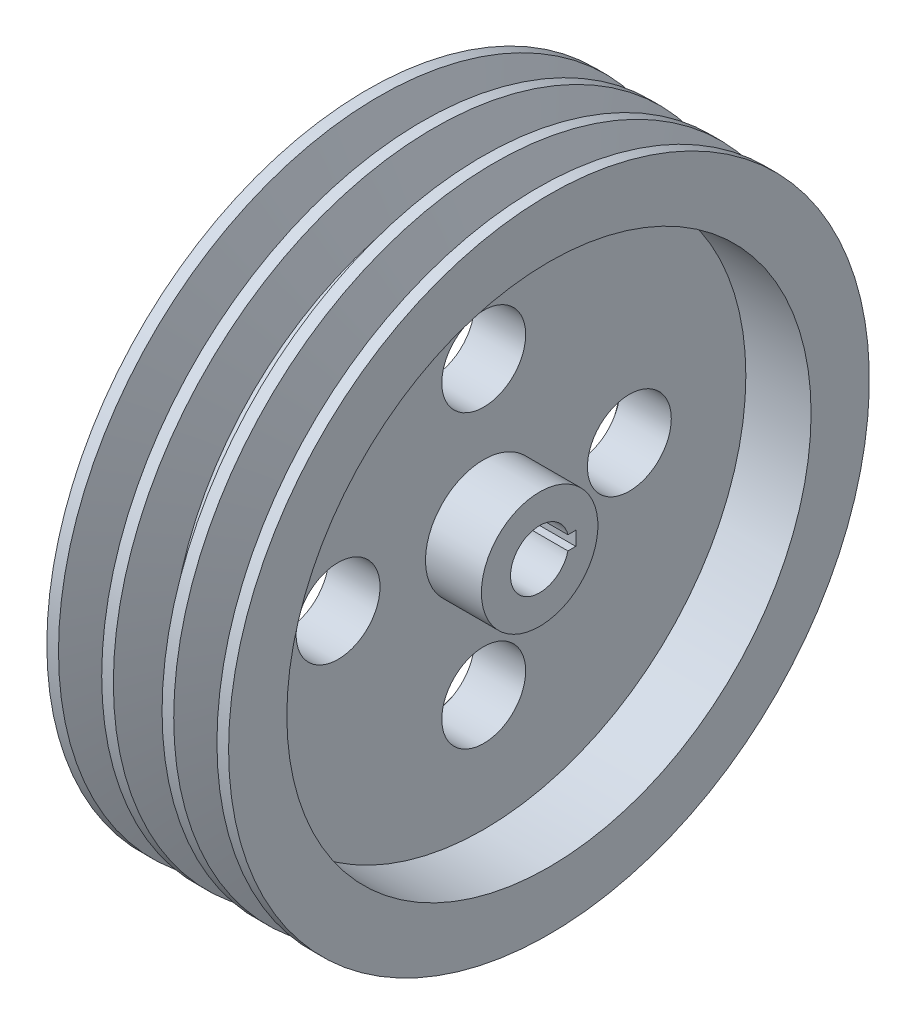
ISO-10303-21;
HEADER;
FILE_DESCRIPTION(('STEP AP214'),'2;1');
FILE_NAME('part.step','',(''),(''),'','','');
FILE_SCHEMA(('AUTOMOTIVE_DESIGN { 1 0 10303 214 1 1 1 1 }'));
ENDSEC;
DATA;
#1=APPLICATION_CONTEXT('core data for automotive mechanical design processes');
#2=APPLICATION_PROTOCOL_DEFINITION('international standard','automotive_design',2000,#1);
#3=PRODUCT_CONTEXT('',#1,'mechanical');
#4=PRODUCT('Part','Part','',(#3));
#5=PRODUCT_RELATED_PRODUCT_CATEGORY('part','',(#4));
#6=PRODUCT_DEFINITION_FORMATION('','',#4);
#7=PRODUCT_DEFINITION_CONTEXT('part definition',#1,'design');
#8=PRODUCT_DEFINITION('design','',#6,#7);
#9=PRODUCT_DEFINITION_SHAPE('','',#8);
#10=(LENGTH_UNIT() NAMED_UNIT(*) SI_UNIT(.MILLI.,.METRE.));
#11=(NAMED_UNIT(*) PLANE_ANGLE_UNIT() SI_UNIT($,.RADIAN.));
#12=(NAMED_UNIT(*) SI_UNIT($,.STERADIAN.) SOLID_ANGLE_UNIT());
#13=UNCERTAINTY_MEASURE_WITH_UNIT(LENGTH_MEASURE(1.E-05),#10,'distance_accuracy_value','');
#14=(GEOMETRIC_REPRESENTATION_CONTEXT(3) GLOBAL_UNCERTAINTY_ASSIGNED_CONTEXT((#13)) GLOBAL_UNIT_ASSIGNED_CONTEXT((#10,
#11,#12)) REPRESENTATION_CONTEXT('',''));
#15=CARTESIAN_POINT('',(0.,0.,0.));
#16=DIRECTION('',(0.,0.,1.));
#17=DIRECTION('',(1.,0.,0.));
#18=AXIS2_PLACEMENT_3D('',#15,#16,#17);
#19=CARTESIAN_POINT('',(-35.,0.,0.));
#20=DIRECTION('',(-1.,0.,0.));
#21=DIRECTION('',(0.,0.,1.));
#22=AXIS2_PLACEMENT_3D('',#19,#20,#21);
#23=CYLINDRICAL_SURFACE('',#22,137.5);
#24=CARTESIAN_POINT('',(15.4523068974331,0.,0.));
#25=DIRECTION('',(-1.,0.,0.));
#26=DIRECTION('',(0.,0.,1.));
#27=AXIS2_PLACEMENT_3D('',#24,#25,#26);
#28=CIRCLE('',#27,137.5);
#29=CARTESIAN_POINT('',(15.4523068974331,0.,137.5));
#30=VERTEX_POINT('',#29);
#31=EDGE_CURVE('E110',#30,#30,#28,.T.);
#32=ORIENTED_EDGE('',*,*,#31,.T.);
#33=EDGE_LOOP('',(#32));
#34=FACE_BOUND('',#33,.T.);
#35=CARTESIAN_POINT('',(10.4523068974331,0.,0.));
#36=DIRECTION('',(-1.,0.,0.));
#37=DIRECTION('',(0.,0.,1.));
#38=AXIS2_PLACEMENT_3D('',#35,#36,#37);
#39=CIRCLE('',#38,137.5);
#40=CARTESIAN_POINT('',(10.4523068974331,0.,137.5));
#41=VERTEX_POINT('',#40);
#42=EDGE_CURVE('E46',#41,#41,#39,.T.);
#43=ORIENTED_EDGE('',*,*,#42,.F.);
#44=EDGE_LOOP('',(#43));
#45=FACE_BOUND('',#44,.T.);
#46=ADVANCED_FACE('F39',(#34,#45),#23,.T.);
#47=CARTESIAN_POINT('',(3.90084268064155,0.,0.));
#48=DIRECTION('',(1.,0.,0.));
#49=DIRECTION('',(0.,0.,-1.));
#50=AXIS2_PLACEMENT_3D('',#47,#48,#49);
#51=CONICAL_SURFACE('',#50,119.5,1.22173047639604);
#52=ORIENTED_EDGE('',*,*,#42,.T.);
#53=EDGE_LOOP('',(#52));
#54=FACE_BOUND('',#53,.T.);
#55=CARTESIAN_POINT('',(3.90084268064155,0.,0.));
#56=DIRECTION('',(-1.,0.,0.));
#57=DIRECTION('',(0.,0.,1.));
#58=AXIS2_PLACEMENT_3D('',#55,#56,#57);
#59=CIRCLE('',#58,119.5);
#60=CARTESIAN_POINT('',(3.90084268064155,0.,119.5));
#61=VERTEX_POINT('',#60);
#62=EDGE_CURVE('E175',#61,#61,#59,.T.);
#63=ORIENTED_EDGE('',*,*,#62,.F.);
#64=EDGE_LOOP('',(#63));
#65=FACE_BOUND('',#64,.T.);
#66=ADVANCED_FACE('F180',(#54,#65),#51,.T.);
#67=CARTESIAN_POINT('',(-35.,0.,0.));
#68=DIRECTION('',(-1.,0.,0.));
#69=DIRECTION('',(0.,0.,1.));
#70=AXIS2_PLACEMENT_3D('',#67,#68,#69);
#71=CYLINDRICAL_SURFACE('',#70,119.5);
#72=ORIENTED_EDGE('',*,*,#62,.T.);
#73=EDGE_LOOP('',(#72));
#74=FACE_BOUND('',#73,.T.);
#75=CARTESIAN_POINT('',(-3.90084268064157,0.,0.));
#76=DIRECTION('',(-1.,0.,0.));
#77=DIRECTION('',(0.,0.,1.));
#78=AXIS2_PLACEMENT_3D('',#75,#76,#77);
#79=CIRCLE('',#78,119.5);
#80=CARTESIAN_POINT('',(-3.90084268064157,0.,119.5));
#81=VERTEX_POINT('',#80);
#82=EDGE_CURVE('E172',#81,#81,#79,.T.);
#83=ORIENTED_EDGE('',*,*,#82,.F.);
#84=EDGE_LOOP('',(#83));
#85=FACE_BOUND('',#84,.T.);
#86=ADVANCED_FACE('F188',(#74,#85),#71,.T.);
#87=CARTESIAN_POINT('',(-10.4523068974332,0.,0.));
#88=DIRECTION('',(-1.,0.,0.));
#89=DIRECTION('',(0.,0.,1.));
#90=AXIS2_PLACEMENT_3D('',#87,#88,#89);
#91=CONICAL_SURFACE('',#90,137.5,1.22173047639603);
#92=ORIENTED_EDGE('',*,*,#82,.T.);
#93=EDGE_LOOP('',(#92));
#94=FACE_BOUND('',#93,.T.);
#95=CARTESIAN_POINT('',(-10.4523068974332,0.,0.));
#96=DIRECTION('',(-1.,0.,0.));
#97=DIRECTION('',(0.,0.,1.));
#98=AXIS2_PLACEMENT_3D('',#95,#96,#97);
#99=CIRCLE('',#98,137.5);
#100=CARTESIAN_POINT('',(-10.4523068974332,0.,137.5));
#101=VERTEX_POINT('',#100);
#102=EDGE_CURVE('E169',#101,#101,#99,.T.);
#103=ORIENTED_EDGE('',*,*,#102,.F.);
#104=EDGE_LOOP('',(#103));
#105=FACE_BOUND('',#104,.T.);
#106=ADVANCED_FACE('F280',(#94,#105),#91,.T.);
#107=CARTESIAN_POINT('',(-35.,0.,0.));
#108=DIRECTION('',(-1.,0.,0.));
#109=DIRECTION('',(0.,0.,1.));
#110=AXIS2_PLACEMENT_3D('',#107,#108,#109);
#111=CYLINDRICAL_SURFACE('',#110,137.5);
#112=ORIENTED_EDGE('',*,*,#102,.T.);
#113=EDGE_LOOP('',(#112));
#114=FACE_BOUND('',#113,.T.);
#115=CARTESIAN_POINT('',(-15.4523068974332,0.,0.));
#116=DIRECTION('',(-1.,0.,0.));
#117=DIRECTION('',(0.,0.,1.));
#118=AXIS2_PLACEMENT_3D('',#115,#116,#117);
#119=CIRCLE('',#118,137.5);
#120=CARTESIAN_POINT('',(-15.4523068974332,0.,137.5));
#121=VERTEX_POINT('',#120);
#122=EDGE_CURVE('E166',#121,#121,#119,.T.);
#123=ORIENTED_EDGE('',*,*,#122,.F.);
#124=EDGE_LOOP('',(#123));
#125=FACE_BOUND('',#124,.T.);
#126=ADVANCED_FACE('F276',(#114,#125),#111,.T.);
#127=CARTESIAN_POINT('',(-22.0037711142248,0.,0.));
#128=DIRECTION('',(1.,0.,0.));
#129=DIRECTION('',(0.,0.,-1.));
#130=AXIS2_PLACEMENT_3D('',#127,#128,#129);
#131=CONICAL_SURFACE('',#130,119.5,1.22173047639603);
#132=ORIENTED_EDGE('',*,*,#122,.T.);
#133=EDGE_LOOP('',(#132));
#134=FACE_BOUND('',#133,.T.);
#135=CARTESIAN_POINT('',(-22.0037711142248,0.,0.));
#136=DIRECTION('',(-1.,0.,0.));
#137=DIRECTION('',(0.,0.,1.));
#138=AXIS2_PLACEMENT_3D('',#135,#136,#137);
#139=CIRCLE('',#138,119.5);
#140=CARTESIAN_POINT('',(-22.0037711142248,0.,119.5));
#141=VERTEX_POINT('',#140);
#142=EDGE_CURVE('E163',#141,#141,#139,.T.);
#143=ORIENTED_EDGE('',*,*,#142,.F.);
#144=EDGE_LOOP('',(#143));
#145=FACE_BOUND('',#144,.T.);
#146=ADVANCED_FACE('F272',(#134,#145),#131,.T.);
#147=CARTESIAN_POINT('',(-35.,0.,0.));
#148=DIRECTION('',(-1.,0.,0.));
#149=DIRECTION('',(0.,0.,1.));
#150=AXIS2_PLACEMENT_3D('',#147,#148,#149);
#151=CYLINDRICAL_SURFACE('',#150,119.5);
#152=ORIENTED_EDGE('',*,*,#142,.T.);
#153=EDGE_LOOP('',(#152));
#154=FACE_BOUND('',#153,.T.);
#155=CARTESIAN_POINT('',(-27.4485357832085,0.,0.));
#156=DIRECTION('',(-1.,0.,0.));
#157=DIRECTION('',(0.,0.,1.));
#158=AXIS2_PLACEMENT_3D('',#155,#156,#157);
#159=CIRCLE('',#158,119.5);
#160=CARTESIAN_POINT('',(-27.4485357832085,0.,119.5));
#161=VERTEX_POINT('',#160);
#162=EDGE_CURVE('E160',#161,#161,#159,.T.);
#163=ORIENTED_EDGE('',*,*,#162,.F.);
#164=EDGE_LOOP('',(#163));
#165=FACE_BOUND('',#164,.T.);
#166=ADVANCED_FACE('F268',(#154,#165),#151,.T.);
#167=CARTESIAN_POINT('',(-34.0000000000001,0.,0.));
#168=DIRECTION('',(-1.,0.,0.));
#169=DIRECTION('',(0.,0.,1.));
#170=AXIS2_PLACEMENT_3D('',#167,#168,#169);
#171=CONICAL_SURFACE('',#170,137.5,1.22173047639603);
#172=ORIENTED_EDGE('',*,*,#162,.T.);
#173=EDGE_LOOP('',(#172));
#174=FACE_BOUND('',#173,.T.);
#175=CARTESIAN_POINT('',(-34.0000000000001,0.,0.));
#176=DIRECTION('',(-1.,0.,0.));
#177=DIRECTION('',(0.,0.,1.));
#178=AXIS2_PLACEMENT_3D('',#175,#176,#177);
#179=CIRCLE('',#178,137.5);
#180=CARTESIAN_POINT('',(-34.0000000000001,0.,137.5));
#181=VERTEX_POINT('',#180);
#182=EDGE_CURVE('E157',#181,#181,#179,.T.);
#183=ORIENTED_EDGE('',*,*,#182,.F.);
#184=EDGE_LOOP('',(#183));
#185=FACE_BOUND('',#184,.T.);
#186=ADVANCED_FACE('F264',(#174,#185),#171,.T.);
#187=CARTESIAN_POINT('',(-35.,0.,0.));
#188=DIRECTION('',(-1.,0.,0.));
#189=DIRECTION('',(0.,0.,1.));
#190=AXIS2_PLACEMENT_3D('',#187,#188,#189);
#191=CYLINDRICAL_SURFACE('',#190,137.5);
#192=ORIENTED_EDGE('',*,*,#182,.T.);
#193=EDGE_LOOP('',(#192));
#194=FACE_BOUND('',#193,.T.);
#195=CARTESIAN_POINT('',(-39.0000000000001,0.,0.));
#196=DIRECTION('',(-1.,0.,0.));
#197=DIRECTION('',(0.,0.,1.));
#198=AXIS2_PLACEMENT_3D('',#195,#196,#197);
#199=CIRCLE('',#198,137.5);
#200=CARTESIAN_POINT('',(-39.0000000000001,0.,137.5));
#201=VERTEX_POINT('',#200);
#202=EDGE_CURVE('E154',#201,#201,#199,.T.);
#203=ORIENTED_EDGE('',*,*,#202,.F.);
#204=EDGE_LOOP('',(#203));
#205=FACE_BOUND('',#204,.T.);
#206=ADVANCED_FACE('F260',(#194,#205),#191,.T.);
#207=CARTESIAN_POINT('',(-39.0000000000001,0.,0.));
#208=DIRECTION('',(-1.,0.,0.));
#209=DIRECTION('',(0.,0.,1.));
#210=AXIS2_PLACEMENT_3D('',#207,#208,#209);
#211=PLANE('',#210);
#212=ORIENTED_EDGE('',*,*,#202,.T.);
#213=EDGE_LOOP('',(#212));
#214=FACE_BOUND('',#213,.T.);
#215=CARTESIAN_POINT('',(-39.0000000000001,0.,0.));
#216=DIRECTION('',(-1.,0.,0.));
#217=DIRECTION('',(0.,0.,1.));
#218=AXIS2_PLACEMENT_3D('',#215,#216,#217);
#219=CIRCLE('',#218,112.5);
#220=CARTESIAN_POINT('',(-39.0000000000001,0.,112.5));
#221=VERTEX_POINT('',#220);
#222=EDGE_CURVE('E151',#221,#221,#219,.T.);
#223=ORIENTED_EDGE('',*,*,#222,.F.);
#224=EDGE_LOOP('',(#223));
#225=FACE_BOUND('',#224,.T.);
#226=ADVANCED_FACE('F256',(#214,#225),#211,.T.);
#227=CARTESIAN_POINT('',(-35.,0.,0.));
#228=DIRECTION('',(-1.,0.,0.));
#229=DIRECTION('',(0.,0.,1.));
#230=AXIS2_PLACEMENT_3D('',#227,#228,#229);
#231=CYLINDRICAL_SURFACE('',#230,112.5);
#232=ORIENTED_EDGE('',*,*,#222,.T.);
#233=EDGE_LOOP('',(#232));
#234=FACE_BOUND('',#233,.T.);
#235=CARTESIAN_POINT('',(-11.,0.,0.));
#236=DIRECTION('',(-1.,0.,0.));
#237=DIRECTION('',(0.,0.,1.));
#238=AXIS2_PLACEMENT_3D('',#235,#236,#237);
#239=CIRCLE('',#238,112.5);
#240=CARTESIAN_POINT('',(-11.,0.,112.5));
#241=VERTEX_POINT('',#240);
#242=EDGE_CURVE('E148',#241,#241,#239,.T.);
#243=ORIENTED_EDGE('',*,*,#242,.F.);
#244=EDGE_LOOP('',(#243));
#245=FACE_BOUND('',#244,.T.);
#246=ADVANCED_FACE('F252',(#234,#245),#231,.F.);
#247=CARTESIAN_POINT('',(-11.,0.,0.));
#248=DIRECTION('',(-1.,0.,0.));
#249=DIRECTION('',(0.,0.,1.));
#250=AXIS2_PLACEMENT_3D('',#247,#248,#249);
#251=PLANE('',#250);
#252=CARTESIAN_POINT('',(-11.,62.5,0.));
#253=DIRECTION('',(-1.,0.,0.));
#254=DIRECTION('',(0.,0.,1.));
#255=AXIS2_PLACEMENT_3D('',#252,#253,#254);
#256=CIRCLE('',#255,18.);
#257=CARTESIAN_POINT('',(-11.,62.5,18.));
#258=VERTEX_POINT('',#257);
#259=EDGE_CURVE('E98',#258,#258,#256,.T.);
#260=ORIENTED_EDGE('',*,*,#259,.F.);
#261=EDGE_LOOP('',(#260));
#262=FACE_BOUND('',#261,.T.);
#263=CARTESIAN_POINT('',(-11.,1.76487577565824E-12,-62.5000000000018));
#264=DIRECTION('',(-1.,0.,0.));
#265=DIRECTION('',(0.,0.,1.));
#266=AXIS2_PLACEMENT_3D('',#263,#264,#265);
#267=CIRCLE('',#266,18.0000000000014);
#268=CARTESIAN_POINT('',(-11.,1.76487577565824E-12,-44.5000000000004));
#269=VERTEX_POINT('',#268);
#270=EDGE_CURVE('E610',#269,#269,#267,.T.);
#271=ORIENTED_EDGE('',*,*,#270,.F.);
#272=EDGE_LOOP('',(#271));
#273=FACE_BOUND('',#272,.T.);
#274=CARTESIAN_POINT('',(-11.,-62.5,-3.53261214567954E-12));
#275=DIRECTION('',(-1.,0.,0.));
#276=DIRECTION('',(0.,0.,1.));
#277=AXIS2_PLACEMENT_3D('',#274,#275,#276);
#278=CIRCLE('',#277,18.0000000000038);
#279=CARTESIAN_POINT('',(-11.,-62.5,18.0000000000003));
#280=VERTEX_POINT('',#279);
#281=EDGE_CURVE('E597',#280,#280,#278,.T.);
#282=ORIENTED_EDGE('',*,*,#281,.F.);
#283=EDGE_LOOP('',(#282));
#284=FACE_BOUND('',#283,.T.);
#285=CARTESIAN_POINT('',(-11.,-1.77252981815291E-12,62.4999999999982));
#286=DIRECTION('',(-1.,0.,0.));
#287=DIRECTION('',(0.,0.,1.));
#288=AXIS2_PLACEMENT_3D('',#285,#286,#287);
#289=CIRCLE('',#288,18.0000000000028);
#290=CARTESIAN_POINT('',(-11.,-1.77252981815291E-12,80.5000000000011));
#291=VERTEX_POINT('',#290);
#292=EDGE_CURVE('E593',#291,#291,#289,.T.);
#293=ORIENTED_EDGE('',*,*,#292,.F.);
#294=EDGE_LOOP('',(#293));
#295=FACE_BOUND('',#294,.T.);
#296=ORIENTED_EDGE('',*,*,#242,.T.);
#297=EDGE_LOOP('',(#296));
#298=FACE_BOUND('',#297,.T.);
#299=CARTESIAN_POINT('',(-11.,0.,0.));
#300=DIRECTION('',(-1.,0.,0.));
#301=DIRECTION('',(0.,0.,1.));
#302=AXIS2_PLACEMENT_3D('',#299,#300,#301);
#303=CIRCLE('',#302,25.);
#304=CARTESIAN_POINT('',(-11.,0.,25.));
#305=VERTEX_POINT('',#304);
#306=EDGE_CURVE('E145',#305,#305,#303,.T.);
#307=ORIENTED_EDGE('',*,*,#306,.F.);
#308=EDGE_LOOP('',(#307));
#309=FACE_BOUND('',#308,.T.);
#310=ADVANCED_FACE('F248',(#262,#273,#284,#295,#298,#309),#251,.T.);
#311=CARTESIAN_POINT('',(-35.,0.,0.));
#312=DIRECTION('',(-1.,0.,0.));
#313=DIRECTION('',(0.,0.,1.));
#314=AXIS2_PLACEMENT_3D('',#311,#312,#313);
#315=CYLINDRICAL_SURFACE('',#314,25.);
#316=ORIENTED_EDGE('',*,*,#306,.T.);
#317=EDGE_LOOP('',(#316));
#318=FACE_BOUND('',#317,.T.);
#319=CARTESIAN_POINT('',(-35.,0.,0.));
#320=DIRECTION('',(-1.,0.,0.));
#321=DIRECTION('',(0.,0.,1.));
#322=AXIS2_PLACEMENT_3D('',#319,#320,#321);
#323=CIRCLE('',#322,25.);
#324=CARTESIAN_POINT('',(-35.,0.,25.));
#325=VERTEX_POINT('',#324);
#326=EDGE_CURVE('E142',#325,#325,#323,.T.);
#327=ORIENTED_EDGE('',*,*,#326,.F.);
#328=EDGE_LOOP('',(#327));
#329=FACE_BOUND('',#328,.T.);
#330=ADVANCED_FACE('F244',(#318,#329),#315,.T.);
#331=CARTESIAN_POINT('',(-35.,0.,0.));
#332=DIRECTION('',(-1.,0.,0.));
#333=DIRECTION('',(0.,0.,1.));
#334=AXIS2_PLACEMENT_3D('',#331,#332,#333);
#335=PLANE('',#334);
#336=DIRECTION('',(0.,0.,-1.));
#337=VECTOR('',#336,1.);
#338=CARTESIAN_POINT('',(-35.,3.,0.));
#339=LINE('',#338,#337);
#340=CARTESIAN_POINT('',(-35.,3.,-12.1346610995116));
#341=VERTEX_POINT('',#340);
#342=CARTESIAN_POINT('',(-35.,3.,-15.5));
#343=VERTEX_POINT('',#342);
#344=EDGE_CURVE('E108',#341,#343,#339,.T.);
#345=ORIENTED_EDGE('',*,*,#344,.F.);
#346=CARTESIAN_POINT('',(-35.,0.,0.));
#347=DIRECTION('',(-1.,0.,0.));
#348=DIRECTION('',(0.,0.,1.));
#349=AXIS2_PLACEMENT_3D('',#346,#347,#348);
#350=CIRCLE('',#349,12.5);
#351=CARTESIAN_POINT('',(-35.,-3.,-12.1346610995116));
#352=VERTEX_POINT('',#351);
#353=EDGE_CURVE('E139',#352,#341,#350,.T.);
#354=ORIENTED_EDGE('',*,*,#353,.F.);
#355=DIRECTION('',(0.,0.,1.));
#356=VECTOR('',#355,1.);
#357=CARTESIAN_POINT('',(-35.,-3.,0.));
#358=LINE('',#357,#356);
#359=CARTESIAN_POINT('',(-35.,-3.,-15.5));
#360=VERTEX_POINT('',#359);
#361=EDGE_CURVE('E104',#360,#352,#358,.T.);
#362=ORIENTED_EDGE('',*,*,#361,.F.);
#363=DIRECTION('',(0.,-1.,0.));
#364=VECTOR('',#363,1.);
#365=CARTESIAN_POINT('',(-35.,0.,-15.5));
#366=LINE('',#365,#364);
#367=EDGE_CURVE('E86',#343,#360,#366,.T.);
#368=ORIENTED_EDGE('',*,*,#367,.F.);
#369=EDGE_LOOP('',(#345,#354,#362,#368));
#370=FACE_BOUND('',#369,.T.);
#371=ORIENTED_EDGE('',*,*,#326,.T.);
#372=EDGE_LOOP('',(#371));
#373=FACE_BOUND('',#372,.T.);
#374=ADVANCED_FACE('F240',(#370,#373),#335,.T.);
#375=CARTESIAN_POINT('',(-35.,0.,0.));
#376=DIRECTION('',(-1.,0.,0.));
#377=DIRECTION('',(0.,0.,1.));
#378=AXIS2_PLACEMENT_3D('',#375,#376,#377);
#379=CYLINDRICAL_SURFACE('',#378,12.5);
#380=DIRECTION('',(-1.,0.,0.));
#381=VECTOR('',#380,1.);
#382=CARTESIAN_POINT('',(-35.,3.,-12.1346610995116));
#383=LINE('',#382,#381);
#384=CARTESIAN_POINT('',(35.,3.,-12.1346610995116));
#385=VERTEX_POINT('',#384);
#386=EDGE_CURVE('E60',#385,#341,#383,.T.);
#387=ORIENTED_EDGE('',*,*,#386,.F.);
#388=CARTESIAN_POINT('',(35.,0.,0.));
#389=DIRECTION('',(-1.,0.,0.));
#390=DIRECTION('',(0.,0.,1.));
#391=AXIS2_PLACEMENT_3D('',#388,#389,#390);
#392=CIRCLE('',#391,12.5);
#393=CARTESIAN_POINT('',(35.,-3.,-12.1346610995116));
#394=VERTEX_POINT('',#393);
#395=EDGE_CURVE('E137',#394,#385,#392,.T.);
#396=ORIENTED_EDGE('',*,*,#395,.F.);
#397=DIRECTION('',(-1.,0.,0.));
#398=VECTOR('',#397,1.);
#399=CARTESIAN_POINT('',(-35.,-3.,-12.1346610995116));
#400=LINE('',#399,#398);
#401=EDGE_CURVE('E52',#352,#394,#400,.F.);
#402=ORIENTED_EDGE('',*,*,#401,.F.);
#403=ORIENTED_EDGE('',*,*,#353,.T.);
#404=EDGE_LOOP('',(#387,#396,#402,#403));
#405=FACE_BOUND('',#404,.T.);
#406=ADVANCED_FACE('F237',(#405),#379,.F.);
#407=CARTESIAN_POINT('',(35.,0.,0.));
#408=DIRECTION('',(1.,0.,0.));
#409=DIRECTION('',(0.,0.,-1.));
#410=AXIS2_PLACEMENT_3D('',#407,#408,#409);
#411=PLANE('',#410);
#412=DIRECTION('',(0.,0.,1.));
#413=VECTOR('',#412,1.);
#414=CARTESIAN_POINT('',(35.,3.,-15.5));
#415=LINE('',#414,#413);
#416=CARTESIAN_POINT('',(35.,3.,-15.5));
#417=VERTEX_POINT('',#416);
#418=EDGE_CURVE('E96',#417,#385,#415,.T.);
#419=ORIENTED_EDGE('',*,*,#418,.F.);
#420=DIRECTION('',(0.,1.,0.));
#421=VECTOR('',#420,1.);
#422=CARTESIAN_POINT('',(35.,3.,-15.5));
#423=LINE('',#422,#421);
#424=CARTESIAN_POINT('',(35.,-3.,-15.5));
#425=VERTEX_POINT('',#424);
#426=EDGE_CURVE('E83',#425,#417,#423,.T.);
#427=ORIENTED_EDGE('',*,*,#426,.F.);
#428=DIRECTION('',(0.,0.,-1.));
#429=VECTOR('',#428,1.);
#430=CARTESIAN_POINT('',(35.,-3.,0.));
#431=LINE('',#430,#429);
#432=EDGE_CURVE('E11',#394,#425,#431,.T.);
#433=ORIENTED_EDGE('',*,*,#432,.F.);
#434=ORIENTED_EDGE('',*,*,#395,.T.);
#435=EDGE_LOOP('',(#419,#427,#433,#434));
#436=FACE_BOUND('',#435,.T.);
#437=CARTESIAN_POINT('',(35.,0.,0.));
#438=DIRECTION('',(-1.,0.,0.));
#439=DIRECTION('',(0.,0.,1.));
#440=AXIS2_PLACEMENT_3D('',#437,#438,#439);
#441=CIRCLE('',#440,25.);
#442=CARTESIAN_POINT('',(35.,0.,25.));
#443=VERTEX_POINT('',#442);
#444=EDGE_CURVE('E134',#443,#443,#441,.T.);
#445=ORIENTED_EDGE('',*,*,#444,.F.);
#446=EDGE_LOOP('',(#445));
#447=FACE_BOUND('',#446,.T.);
#448=ADVANCED_FACE('F94',(#436,#447),#411,.T.);
#449=CARTESIAN_POINT('',(-35.,0.,0.));
#450=DIRECTION('',(-1.,0.,0.));
#451=DIRECTION('',(0.,0.,1.));
#452=AXIS2_PLACEMENT_3D('',#449,#450,#451);
#453=CYLINDRICAL_SURFACE('',#452,25.);
#454=ORIENTED_EDGE('',*,*,#444,.T.);
#455=EDGE_LOOP('',(#454));
#456=FACE_BOUND('',#455,.T.);
#457=CARTESIAN_POINT('',(11.,0.,0.));
#458=DIRECTION('',(-1.,0.,0.));
#459=DIRECTION('',(0.,0.,1.));
#460=AXIS2_PLACEMENT_3D('',#457,#458,#459);
#461=CIRCLE('',#460,25.);
#462=CARTESIAN_POINT('',(11.,0.,25.));
#463=VERTEX_POINT('',#462);
#464=EDGE_CURVE('E131',#463,#463,#461,.T.);
#465=ORIENTED_EDGE('',*,*,#464,.F.);
#466=EDGE_LOOP('',(#465));
#467=FACE_BOUND('',#466,.T.);
#468=ADVANCED_FACE('F230',(#456,#467),#453,.T.);
#469=CARTESIAN_POINT('',(11.,0.,0.));
#470=DIRECTION('',(1.,0.,0.));
#471=DIRECTION('',(0.,0.,-1.));
#472=AXIS2_PLACEMENT_3D('',#469,#470,#471);
#473=PLANE('',#472);
#474=CARTESIAN_POINT('',(11.,62.5,0.));
#475=DIRECTION('',(1.,0.,0.));
#476=DIRECTION('',(0.,0.,-1.));
#477=AXIS2_PLACEMENT_3D('',#474,#475,#476);
#478=CIRCLE('',#477,18.);
#479=CARTESIAN_POINT('',(11.,62.5,-18.));
#480=VERTEX_POINT('',#479);
#481=EDGE_CURVE('E592',#480,#480,#478,.T.);
#482=ORIENTED_EDGE('',*,*,#481,.F.);
#483=EDGE_LOOP('',(#482));
#484=FACE_BOUND('',#483,.T.);
#485=CARTESIAN_POINT('',(11.,1.76487577565824E-12,-62.5000000000018));
#486=DIRECTION('',(1.,0.,0.));
#487=DIRECTION('',(0.,0.,-1.));
#488=AXIS2_PLACEMENT_3D('',#485,#486,#487);
#489=CIRCLE('',#488,18.0000000000014);
#490=CARTESIAN_POINT('',(11.,1.76487577565824E-12,-80.5000000000031));
#491=VERTEX_POINT('',#490);
#492=EDGE_CURVE('E594',#491,#491,#489,.T.);
#493=ORIENTED_EDGE('',*,*,#492,.F.);
#494=EDGE_LOOP('',(#493));
#495=FACE_BOUND('',#494,.T.);
#496=CARTESIAN_POINT('',(11.,-62.5,-3.53261214567954E-12));
#497=DIRECTION('',(1.,0.,0.));
#498=DIRECTION('',(0.,0.,-1.));
#499=AXIS2_PLACEMENT_3D('',#496,#497,#498);
#500=CIRCLE('',#499,18.0000000000038);
#501=CARTESIAN_POINT('',(11.,-62.5,-18.0000000000073));
#502=VERTEX_POINT('',#501);
#503=EDGE_CURVE('E600',#502,#502,#500,.T.);
#504=ORIENTED_EDGE('',*,*,#503,.F.);
#505=EDGE_LOOP('',(#504));
#506=FACE_BOUND('',#505,.T.);
#507=CARTESIAN_POINT('',(11.,-1.77252981815291E-12,62.4999999999982));
#508=DIRECTION('',(1.,0.,0.));
#509=DIRECTION('',(0.,0.,-1.));
#510=AXIS2_PLACEMENT_3D('',#507,#508,#509);
#511=CIRCLE('',#510,18.0000000000028);
#512=CARTESIAN_POINT('',(11.,-1.77252981815291E-12,44.4999999999954));
#513=VERTEX_POINT('',#512);
#514=EDGE_CURVE('E605',#513,#513,#511,.T.);
#515=ORIENTED_EDGE('',*,*,#514,.F.);
#516=EDGE_LOOP('',(#515));
#517=FACE_BOUND('',#516,.T.);
#518=ORIENTED_EDGE('',*,*,#464,.T.);
#519=EDGE_LOOP('',(#518));
#520=FACE_BOUND('',#519,.T.);
#521=CARTESIAN_POINT('',(11.,0.,0.));
#522=DIRECTION('',(-1.,0.,0.));
#523=DIRECTION('',(0.,0.,1.));
#524=AXIS2_PLACEMENT_3D('',#521,#522,#523);
#525=CIRCLE('',#524,112.5);
#526=CARTESIAN_POINT('',(11.,0.,112.5));
#527=VERTEX_POINT('',#526);
#528=EDGE_CURVE('E128',#527,#527,#525,.T.);
#529=ORIENTED_EDGE('',*,*,#528,.F.);
#530=EDGE_LOOP('',(#529));
#531=FACE_BOUND('',#530,.T.);
#532=ADVANCED_FACE('F224',(#484,#495,#506,#517,#520,#531),#473,.T.);
#533=CARTESIAN_POINT('',(-35.,0.,0.));
#534=DIRECTION('',(-1.,0.,0.));
#535=DIRECTION('',(0.,0.,1.));
#536=AXIS2_PLACEMENT_3D('',#533,#534,#535);
#537=CYLINDRICAL_SURFACE('',#536,112.5);
#538=ORIENTED_EDGE('',*,*,#528,.T.);
#539=EDGE_LOOP('',(#538));
#540=FACE_BOUND('',#539,.T.);
#541=CARTESIAN_POINT('',(38.9999999999999,0.,0.));
#542=DIRECTION('',(-1.,0.,0.));
#543=DIRECTION('',(0.,0.,1.));
#544=AXIS2_PLACEMENT_3D('',#541,#542,#543);
#545=CIRCLE('',#544,112.5);
#546=CARTESIAN_POINT('',(38.9999999999999,0.,112.5));
#547=VERTEX_POINT('',#546);
#548=EDGE_CURVE('E125',#547,#547,#545,.T.);
#549=ORIENTED_EDGE('',*,*,#548,.F.);
#550=EDGE_LOOP('',(#549));
#551=FACE_BOUND('',#550,.T.);
#552=ADVANCED_FACE('F218',(#540,#551),#537,.F.);
#553=CARTESIAN_POINT('',(38.9999999999999,0.,0.));
#554=DIRECTION('',(1.,0.,0.));
#555=DIRECTION('',(0.,0.,-1.));
#556=AXIS2_PLACEMENT_3D('',#553,#554,#555);
#557=PLANE('',#556);
#558=ORIENTED_EDGE('',*,*,#548,.T.);
#559=EDGE_LOOP('',(#558));
#560=FACE_BOUND('',#559,.T.);
#561=CARTESIAN_POINT('',(38.9999999999999,0.,0.));
#562=DIRECTION('',(-1.,0.,0.));
#563=DIRECTION('',(0.,0.,1.));
#564=AXIS2_PLACEMENT_3D('',#561,#562,#563);
#565=CIRCLE('',#564,137.5);
#566=CARTESIAN_POINT('',(38.9999999999999,0.,137.5));
#567=VERTEX_POINT('',#566);
#568=EDGE_CURVE('E122',#567,#567,#565,.T.);
#569=ORIENTED_EDGE('',*,*,#568,.F.);
#570=EDGE_LOOP('',(#569));
#571=FACE_BOUND('',#570,.T.);
#572=ADVANCED_FACE('F213',(#560,#571),#557,.T.);
#573=CARTESIAN_POINT('',(-35.,0.,0.));
#574=DIRECTION('',(-1.,0.,0.));
#575=DIRECTION('',(0.,0.,1.));
#576=AXIS2_PLACEMENT_3D('',#573,#574,#575);
#577=CYLINDRICAL_SURFACE('',#576,137.5);
#578=CARTESIAN_POINT('',(33.9999999999999,0.,0.));
#579=DIRECTION('',(-1.,0.,0.));
#580=DIRECTION('',(0.,0.,1.));
#581=AXIS2_PLACEMENT_3D('',#578,#579,#580);
#582=CIRCLE('',#581,137.5);
#583=CARTESIAN_POINT('',(33.9999999999999,0.,137.5));
#584=VERTEX_POINT('',#583);
#585=EDGE_CURVE('E119',#584,#584,#582,.T.);
#586=ORIENTED_EDGE('',*,*,#585,.F.);
#587=EDGE_LOOP('',(#586));
#588=FACE_BOUND('',#587,.T.);
#589=ORIENTED_EDGE('',*,*,#568,.T.);
#590=EDGE_LOOP('',(#589));
#591=FACE_BOUND('',#590,.T.);
#592=ADVANCED_FACE('F207',(#588,#591),#577,.T.);
#593=CARTESIAN_POINT('',(33.9999999999999,0.,0.));
#594=DIRECTION('',(1.,0.,0.));
#595=DIRECTION('',(0.,0.,-1.));
#596=AXIS2_PLACEMENT_3D('',#593,#594,#595);
#597=CONICAL_SURFACE('',#596,137.5,1.22173047639604);
#598=CARTESIAN_POINT('',(27.4485357832084,0.,0.));
#599=DIRECTION('',(-1.,0.,0.));
#600=DIRECTION('',(0.,0.,1.));
#601=AXIS2_PLACEMENT_3D('',#598,#599,#600);
#602=CIRCLE('',#601,119.5);
#603=CARTESIAN_POINT('',(27.4485357832084,0.,119.5));
#604=VERTEX_POINT('',#603);
#605=EDGE_CURVE('E116',#604,#604,#602,.T.);
#606=ORIENTED_EDGE('',*,*,#605,.F.);
#607=EDGE_LOOP('',(#606));
#608=FACE_BOUND('',#607,.T.);
#609=ORIENTED_EDGE('',*,*,#585,.T.);
#610=EDGE_LOOP('',(#609));
#611=FACE_BOUND('',#610,.T.);
#612=ADVANCED_FACE('F201',(#608,#611),#597,.T.);
#613=CARTESIAN_POINT('',(-35.,0.,0.));
#614=DIRECTION('',(-1.,0.,0.));
#615=DIRECTION('',(0.,0.,1.));
#616=AXIS2_PLACEMENT_3D('',#613,#614,#615);
#617=CYLINDRICAL_SURFACE('',#616,119.5);
#618=CARTESIAN_POINT('',(22.0037711142247,0.,0.));
#619=DIRECTION('',(-1.,0.,0.));
#620=DIRECTION('',(0.,0.,1.));
#621=AXIS2_PLACEMENT_3D('',#618,#619,#620);
#622=CIRCLE('',#621,119.5);
#623=CARTESIAN_POINT('',(22.0037711142247,0.,119.5));
#624=VERTEX_POINT('',#623);
#625=EDGE_CURVE('E113',#624,#624,#622,.T.);
#626=ORIENTED_EDGE('',*,*,#625,.F.);
#627=EDGE_LOOP('',(#626));
#628=FACE_BOUND('',#627,.T.);
#629=ORIENTED_EDGE('',*,*,#605,.T.);
#630=EDGE_LOOP('',(#629));
#631=FACE_BOUND('',#630,.T.);
#632=ADVANCED_FACE('F195',(#628,#631),#617,.T.);
#633=CARTESIAN_POINT('',(22.0037711142247,0.,0.));
#634=DIRECTION('',(-1.,0.,0.));
#635=DIRECTION('',(0.,0.,1.));
#636=AXIS2_PLACEMENT_3D('',#633,#634,#635);
#637=CONICAL_SURFACE('',#636,119.5,1.22173047639603);
#638=ORIENTED_EDGE('',*,*,#31,.F.);
#639=EDGE_LOOP('',(#638));
#640=FACE_BOUND('',#639,.T.);
#641=ORIENTED_EDGE('',*,*,#625,.T.);
#642=EDGE_LOOP('',(#641));
#643=FACE_BOUND('',#642,.T.);
#644=ADVANCED_FACE('F191',(#640,#643),#637,.T.);
#645=CARTESIAN_POINT('',(-39.0000000000001,3.,-15.5));
#646=DIRECTION('',(0.,1.,0.));
#647=DIRECTION('',(0.,0.,1.));
#648=AXIS2_PLACEMENT_3D('',#645,#646,#647);
#649=PLANE('',#648);
#650=ORIENTED_EDGE('',*,*,#344,.T.);
#651=DIRECTION('',(1.,0.,0.));
#652=VECTOR('',#651,1.);
#653=CARTESIAN_POINT('',(-39.0000000000001,3.,-15.5));
#654=LINE('',#653,#652);
#655=EDGE_CURVE('E88',#343,#417,#654,.T.);
#656=ORIENTED_EDGE('',*,*,#655,.T.);
#657=ORIENTED_EDGE('',*,*,#418,.T.);
#658=ORIENTED_EDGE('',*,*,#386,.T.);
#659=EDGE_LOOP('',(#650,#656,#657,#658));
#660=FACE_BOUND('',#659,.T.);
#661=ADVANCED_FACE('F194',(#660),#649,.F.);
#662=CARTESIAN_POINT('',(-39.0000000000001,3.,-15.5));
#663=DIRECTION('',(0.,0.,-1.));
#664=DIRECTION('',(-1.,0.,0.));
#665=AXIS2_PLACEMENT_3D('',#662,#663,#664);
#666=PLANE('',#665);
#667=ORIENTED_EDGE('',*,*,#367,.T.);
#668=DIRECTION('',(1.,0.,0.));
#669=VECTOR('',#668,1.);
#670=CARTESIAN_POINT('',(-39.0000000000001,-3.,-15.5));
#671=LINE('',#670,#669);
#672=EDGE_CURVE('E79',#360,#425,#671,.T.);
#673=ORIENTED_EDGE('',*,*,#672,.T.);
#674=ORIENTED_EDGE('',*,*,#426,.T.);
#675=ORIENTED_EDGE('',*,*,#655,.F.);
#676=EDGE_LOOP('',(#667,#673,#674,#675));
#677=FACE_BOUND('',#676,.T.);
#678=ADVANCED_FACE('F80',(#677),#666,.F.);
#679=CARTESIAN_POINT('',(-39.0000000000001,-3.,-15.5));
#680=DIRECTION('',(0.,-1.,0.));
#681=DIRECTION('',(0.,0.,-1.));
#682=AXIS2_PLACEMENT_3D('',#679,#680,#681);
#683=PLANE('',#682);
#684=ORIENTED_EDGE('',*,*,#361,.T.);
#685=ORIENTED_EDGE('',*,*,#401,.T.);
#686=ORIENTED_EDGE('',*,*,#432,.T.);
#687=ORIENTED_EDGE('',*,*,#672,.F.);
#688=EDGE_LOOP('',(#684,#685,#686,#687));
#689=FACE_BOUND('',#688,.T.);
#690=ADVANCED_FACE('F90',(#689),#683,.F.);
#691=CARTESIAN_POINT('',(-39.0000000000001,-1.77252981815291E-12,62.4999999999982));
#692=DIRECTION('',(1.,0.,0.));
#693=DIRECTION('',(0.,0.,-1.));
#694=AXIS2_PLACEMENT_3D('',#691,#692,#693);
#695=CYLINDRICAL_SURFACE('',#694,18.0000000000028);
#696=ORIENTED_EDGE('',*,*,#292,.T.);
#697=EDGE_LOOP('',(#696));
#698=FACE_BOUND('',#697,.T.);
#699=ORIENTED_EDGE('',*,*,#514,.T.);
#700=EDGE_LOOP('',(#699));
#701=FACE_BOUND('',#700,.T.);
#702=ADVANCED_FACE('F436',(#698,#701),#695,.F.);
#703=CARTESIAN_POINT('',(-39.0000000000001,-62.5,-3.53261214567954E-12));
#704=DIRECTION('',(1.,0.,0.));
#705=DIRECTION('',(0.,0.,-1.));
#706=AXIS2_PLACEMENT_3D('',#703,#704,#705);
#707=CYLINDRICAL_SURFACE('',#706,18.0000000000038);
#708=ORIENTED_EDGE('',*,*,#281,.T.);
#709=EDGE_LOOP('',(#708));
#710=FACE_BOUND('',#709,.T.);
#711=ORIENTED_EDGE('',*,*,#503,.T.);
#712=EDGE_LOOP('',(#711));
#713=FACE_BOUND('',#712,.T.);
#714=ADVANCED_FACE('F442',(#710,#713),#707,.F.);
#715=CARTESIAN_POINT('',(-39.0000000000001,1.76487577565824E-12,-62.5000000000018));
#716=DIRECTION('',(1.,0.,0.));
#717=DIRECTION('',(0.,0.,-1.));
#718=AXIS2_PLACEMENT_3D('',#715,#716,#717);
#719=CYLINDRICAL_SURFACE('',#718,18.0000000000014);
#720=ORIENTED_EDGE('',*,*,#270,.T.);
#721=EDGE_LOOP('',(#720));
#722=FACE_BOUND('',#721,.T.);
#723=ORIENTED_EDGE('',*,*,#492,.T.);
#724=EDGE_LOOP('',(#723));
#725=FACE_BOUND('',#724,.T.);
#726=ADVANCED_FACE('F450',(#722,#725),#719,.F.);
#727=CARTESIAN_POINT('',(-39.0000000000001,62.5,0.));
#728=DIRECTION('',(1.,0.,0.));
#729=DIRECTION('',(0.,0.,-1.));
#730=AXIS2_PLACEMENT_3D('',#727,#728,#729);
#731=CYLINDRICAL_SURFACE('',#730,18.);
#732=ORIENTED_EDGE('',*,*,#259,.T.);
#733=EDGE_LOOP('',(#732));
#734=FACE_BOUND('',#733,.T.);
#735=ORIENTED_EDGE('',*,*,#481,.T.);
#736=EDGE_LOOP('',(#735));
#737=FACE_BOUND('',#736,.T.);
#738=ADVANCED_FACE('F458',(#734,#737),#731,.F.);
#739=CLOSED_SHELL('',(#46,#66,#86,#106,#126,#146,#166,#186,#206,#226,#246,#310,#330,#374,#406,
#448,#468,#532,#552,#572,#592,#612,#632,#644,#661,#678,#690,#702,#714,#726,#738));
#740=MANIFOLD_SOLID_BREP('B2',#739);
#741=ADVANCED_BREP_SHAPE_REPRESENTATION('',(#18,#740),#14);
#742=SHAPE_DEFINITION_REPRESENTATION(#9,#741);
ENDSEC;
END-ISO-10303-21;
